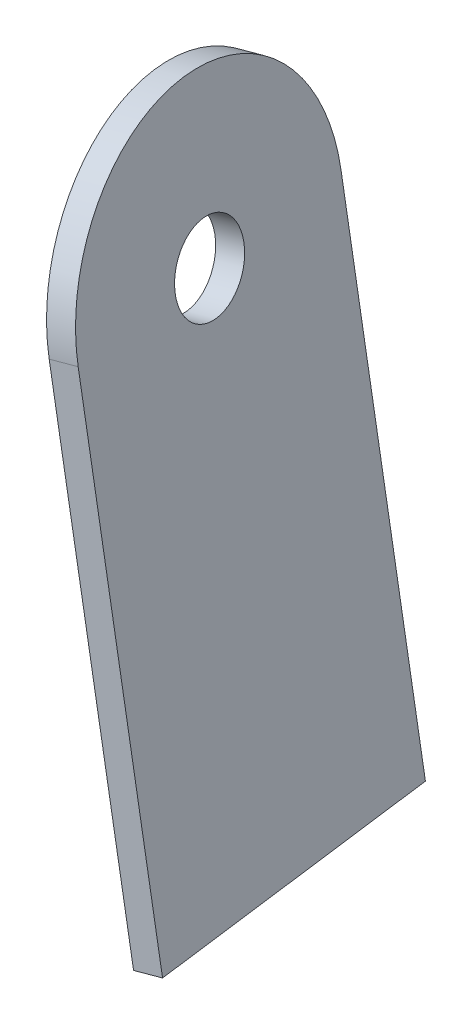
ISO-10303-21;
HEADER;
FILE_DESCRIPTION(('STEP AP214'),'2;1');
FILE_NAME('part.step','',(''),(''),'','','');
FILE_SCHEMA(('AUTOMOTIVE_DESIGN { 1 0 10303 214 1 1 1 1 }'));
ENDSEC;
DATA;
#1=APPLICATION_CONTEXT('core data for automotive mechanical design processes');
#2=APPLICATION_PROTOCOL_DEFINITION('international standard','automotive_design',2000,#1);
#3=PRODUCT_CONTEXT('',#1,'mechanical');
#4=PRODUCT('Part','Part','',(#3));
#5=PRODUCT_RELATED_PRODUCT_CATEGORY('part','',(#4));
#6=PRODUCT_DEFINITION_FORMATION('','',#4);
#7=PRODUCT_DEFINITION_CONTEXT('part definition',#1,'design');
#8=PRODUCT_DEFINITION('design','',#6,#7);
#9=PRODUCT_DEFINITION_SHAPE('','',#8);
#10=(LENGTH_UNIT() NAMED_UNIT(*) SI_UNIT(.MILLI.,.METRE.));
#11=(NAMED_UNIT(*) PLANE_ANGLE_UNIT() SI_UNIT($,.RADIAN.));
#12=(NAMED_UNIT(*) SI_UNIT($,.STERADIAN.) SOLID_ANGLE_UNIT());
#13=UNCERTAINTY_MEASURE_WITH_UNIT(LENGTH_MEASURE(1.E-05),#10,'distance_accuracy_value','');
#14=(GEOMETRIC_REPRESENTATION_CONTEXT(3) GLOBAL_UNCERTAINTY_ASSIGNED_CONTEXT((#13)) GLOBAL_UNIT_ASSIGNED_CONTEXT((#10,
#11,#12)) REPRESENTATION_CONTEXT('',''));
#15=CARTESIAN_POINT('',(0.,0.,0.));
#16=DIRECTION('',(0.,0.,1.));
#17=DIRECTION('',(1.,0.,0.));
#18=AXIS2_PLACEMENT_3D('',#15,#16,#17);
#19=CARTESIAN_POINT('',(366.374719779069,-183.61507369825,-606.828394282392));
#20=DIRECTION('',(-0.97605930706617,-0.162811693157859,0.144224067549693));
#21=DIRECTION('',(-0.164531864547568,0.986371768426338,0.));
#22=AXIS2_PLACEMENT_3D('',#19,#20,#21);
#23=PLANE('',#22);
#24=DIRECTION('',(-0.143282352776934,-0.0175746658269811,-0.989525794764228));
#25=VECTOR('',#24,1.);
#26=CARTESIAN_POINT('',(372.727263693812,-213.516214065003,-597.591348457077));
#27=LINE('',#26,#25);
#28=CARTESIAN_POINT('',(372.727263693812,-213.516214065003,-597.591348457077));
#29=VERTEX_POINT('',#28);
#30=CARTESIAN_POINT('',(369.997734873412,-213.851011449007,-616.441814847336));
#31=VERTEX_POINT('',#30);
#32=EDGE_CURVE('E95',#29,#31,#27,.T.);
#33=ORIENTED_EDGE('',*,*,#32,.F.);
#34=DIRECTION('',(0.163641059860335,-0.986500625287253,-0.00617412630625064));
#35=VECTOR('',#34,1.);
#36=CARTESIAN_POINT('',(367.739484189269,-183.447675006248,-597.403161087262));
#37=LINE('',#36,#35);
#38=CARTESIAN_POINT('',(367.739484189269,-183.447675006248,-597.403161087262));
#39=VERTEX_POINT('',#38);
#40=EDGE_CURVE('E98',#39,#29,#37,.T.);
#41=ORIENTED_EDGE('',*,*,#40,.F.);
#42=CARTESIAN_POINT('',(366.374719779069,-183.61507369825,-606.828394282392));
#43=DIRECTION('',(0.97605930706617,0.162811693157859,-0.144224067549693));
#44=DIRECTION('',(-0.164531864547568,0.986371768426338,0.));
#45=AXIS2_PLACEMENT_3D('',#42,#43,#44);
#46=CIRCLE('',#45,9.52500000000007);
#47=CARTESIAN_POINT('',(365.009955368868,-183.782472390252,-616.253627477521));
#48=VERTEX_POINT('',#47);
#49=EDGE_CURVE('E86',#48,#39,#46,.T.);
#50=ORIENTED_EDGE('',*,*,#49,.F.);
#51=DIRECTION('',(-0.163641059860335,0.986500625287253,0.00617412630625063));
#52=VECTOR('',#51,1.);
#53=CARTESIAN_POINT('',(369.997734873412,-213.851011449007,-616.441814847336));
#54=LINE('',#53,#52);
#55=EDGE_CURVE('E91',#31,#48,#54,.T.);
#56=ORIENTED_EDGE('',*,*,#55,.F.);
#57=EDGE_LOOP('',(#33,#41,#50,#56));
#58=FACE_BOUND('',#57,.T.);
#59=CARTESIAN_POINT('',(366.374719779069,-183.61507369825,-606.828394282392));
#60=DIRECTION('',(0.97605930706617,0.162811693157859,-0.144224067549693));
#61=DIRECTION('',(-0.164531864547568,0.986371768426338,0.));
#62=AXIS2_PLACEMENT_3D('',#59,#60,#61);
#63=CIRCLE('',#62,2.4891999999999);
#64=CARTESIAN_POINT('',(366.784272496301,-186.070350304217,-606.828394282392));
#65=VERTEX_POINT('',#64);
#66=EDGE_CURVE('E107',#65,#65,#63,.T.);
#67=ORIENTED_EDGE('',*,*,#66,.T.);
#68=EDGE_LOOP('',(#67));
#69=FACE_BOUND('',#68,.T.);
#70=ADVANCED_FACE('F39',(#58,#69),#23,.T.);
#71=CARTESIAN_POINT('',(367.924213929036,-183.356610135362,-607.057349989627));
#72=DIRECTION('',(-0.97605930706617,-0.162811693157859,0.144224067549693));
#73=DIRECTION('',(-0.164531864547568,0.986371768426338,0.));
#74=AXIS2_PLACEMENT_3D('',#71,#72,#73);
#75=PLANE('',#74);
#76=DIRECTION('',(-0.143282352776934,-0.0175746658269811,-0.989525794764228));
#77=VECTOR('',#76,1.);
#78=CARTESIAN_POINT('',(374.27675784378,-213.257750502115,-597.820304164312));
#79=LINE('',#78,#77);
#80=CARTESIAN_POINT('',(374.27675784378,-213.257750502115,-597.820304164312));
#81=VERTEX_POINT('',#80);
#82=CARTESIAN_POINT('',(371.547229023379,-213.592547886119,-616.670770554571));
#83=VERTEX_POINT('',#82);
#84=EDGE_CURVE('E103',#81,#83,#79,.T.);
#85=ORIENTED_EDGE('',*,*,#84,.T.);
#86=DIRECTION('',(-0.163641059860335,0.986500625287253,0.00617412630625063));
#87=VECTOR('',#86,1.);
#88=CARTESIAN_POINT('',(371.547229023379,-213.592547886119,-616.670770554571));
#89=LINE('',#88,#87);
#90=CARTESIAN_POINT('',(366.559449518836,-183.524008827364,-616.482583184756));
#91=VERTEX_POINT('',#90);
#92=EDGE_CURVE('E106',#83,#91,#89,.T.);
#93=ORIENTED_EDGE('',*,*,#92,.T.);
#94=CARTESIAN_POINT('',(367.924213929036,-183.356610135362,-607.057349989627));
#95=DIRECTION('',(0.97605930706617,0.162811693157859,-0.144224067549693));
#96=DIRECTION('',(-0.164531864547568,0.986371768426338,0.));
#97=AXIS2_PLACEMENT_3D('',#94,#95,#96);
#98=CIRCLE('',#97,9.52500000000007);
#99=CARTESIAN_POINT('',(369.288978339237,-183.18921144336,-597.632116794498));
#100=VERTEX_POINT('',#99);
#101=EDGE_CURVE('E89',#91,#100,#98,.T.);
#102=ORIENTED_EDGE('',*,*,#101,.T.);
#103=DIRECTION('',(0.163641059860335,-0.986500625287253,-0.00617412630625064));
#104=VECTOR('',#103,1.);
#105=CARTESIAN_POINT('',(369.288978339237,-183.18921144336,-597.632116794498));
#106=LINE('',#105,#104);
#107=EDGE_CURVE('E110',#100,#81,#106,.T.);
#108=ORIENTED_EDGE('',*,*,#107,.T.);
#109=EDGE_LOOP('',(#85,#93,#102,#108));
#110=FACE_BOUND('',#109,.T.);
#111=CARTESIAN_POINT('',(367.924213929036,-183.356610135362,-607.057349989627));
#112=DIRECTION('',(0.97605930706617,0.162811693157859,-0.144224067549693));
#113=DIRECTION('',(-0.164531864547568,0.986371768426338,0.));
#114=AXIS2_PLACEMENT_3D('',#111,#112,#113);
#115=CIRCLE('',#114,2.4891999999999);
#116=CARTESIAN_POINT('',(368.333766646268,-185.811886741329,-607.057349989627));
#117=VERTEX_POINT('',#116);
#118=EDGE_CURVE('E115',#117,#117,#115,.T.);
#119=ORIENTED_EDGE('',*,*,#118,.F.);
#120=EDGE_LOOP('',(#119));
#121=FACE_BOUND('',#120,.T.);
#122=ADVANCED_FACE('F128',(#110,#121),#75,.F.);
#123=CARTESIAN_POINT('',(372.727263693812,-213.516214065003,-597.591348457077));
#124=DIRECTION('',(-0.163641059860334,0.986500625287253,0.00617412630625166));
#125=DIRECTION('',(0.986519428445685,0.163644178934662,0.));
#126=AXIS2_PLACEMENT_3D('',#123,#124,#125);
#127=PLANE('',#126);
#128=ORIENTED_EDGE('',*,*,#84,.F.);
#129=DIRECTION('',(0.97605930706617,0.162811693157859,-0.144224067549693));
#130=VECTOR('',#129,1.);
#131=CARTESIAN_POINT('',(372.727263693812,-213.516214065003,-597.591348457077));
#132=LINE('',#131,#130);
#133=EDGE_CURVE('E56',#29,#81,#132,.T.);
#134=ORIENTED_EDGE('',*,*,#133,.F.);
#135=ORIENTED_EDGE('',*,*,#32,.T.);
#136=DIRECTION('',(0.97605930706617,0.162811693157859,-0.144224067549693));
#137=VECTOR('',#136,1.);
#138=CARTESIAN_POINT('',(369.997734873412,-213.851011449007,-616.441814847336));
#139=LINE('',#138,#137);
#140=EDGE_CURVE('E11',#31,#83,#139,.T.);
#141=ORIENTED_EDGE('',*,*,#140,.T.);
#142=EDGE_LOOP('',(#128,#134,#135,#141));
#143=FACE_BOUND('',#142,.T.);
#144=ADVANCED_FACE('F41',(#143),#127,.F.);
#145=CARTESIAN_POINT('',(369.997734873412,-213.851011449007,-616.441814847336));
#146=DIRECTION('',(0.143282352776934,0.0175746658269822,0.989525794764228));
#147=DIRECTION('',(-0.989678647035072,0.,0.143304485634015));
#148=AXIS2_PLACEMENT_3D('',#145,#146,#147);
#149=PLANE('',#148);
#150=ORIENTED_EDGE('',*,*,#92,.F.);
#151=ORIENTED_EDGE('',*,*,#140,.F.);
#152=ORIENTED_EDGE('',*,*,#55,.T.);
#153=DIRECTION('',(0.97605930706617,0.162811693157859,-0.144224067549693));
#154=VECTOR('',#153,1.);
#155=CARTESIAN_POINT('',(365.009955368868,-183.782472390252,-616.253627477521));
#156=LINE('',#155,#154);
#157=EDGE_CURVE('E48',#48,#91,#156,.T.);
#158=ORIENTED_EDGE('',*,*,#157,.T.);
#159=EDGE_LOOP('',(#150,#151,#152,#158));
#160=FACE_BOUND('',#159,.T.);
#161=ADVANCED_FACE('F92',(#160),#149,.F.);
#162=CARTESIAN_POINT('',(366.374719779069,-183.61507369825,-606.828394282392));
#163=DIRECTION('',(0.97605930706617,0.162811693157859,-0.144224067549693));
#164=DIRECTION('',(0.164531864547568,-0.986371768426338,0.));
#165=AXIS2_PLACEMENT_3D('',#162,#163,#164);
#166=CYLINDRICAL_SURFACE('',#165,9.52500000000007);
#167=ORIENTED_EDGE('',*,*,#101,.F.);
#168=ORIENTED_EDGE('',*,*,#157,.F.);
#169=ORIENTED_EDGE('',*,*,#49,.T.);
#170=DIRECTION('',(0.97605930706617,0.162811693157859,-0.144224067549693));
#171=VECTOR('',#170,1.);
#172=CARTESIAN_POINT('',(367.739484189269,-183.447675006248,-597.403161087262));
#173=LINE('',#172,#171);
#174=EDGE_CURVE('E72',#39,#100,#173,.T.);
#175=ORIENTED_EDGE('',*,*,#174,.T.);
#176=EDGE_LOOP('',(#167,#168,#169,#175));
#177=FACE_BOUND('',#176,.T.);
#178=ADVANCED_FACE('F84',(#177),#166,.T.);
#179=CARTESIAN_POINT('',(367.739484189269,-183.447675006248,-597.403161087262));
#180=DIRECTION('',(-0.143282352776934,-0.0175746658269822,-0.989525794764228));
#181=DIRECTION('',(0.989678647035072,0.,-0.143304485634015));
#182=AXIS2_PLACEMENT_3D('',#179,#180,#181);
#183=PLANE('',#182);
#184=ORIENTED_EDGE('',*,*,#107,.F.);
#185=ORIENTED_EDGE('',*,*,#174,.F.);
#186=ORIENTED_EDGE('',*,*,#40,.T.);
#187=ORIENTED_EDGE('',*,*,#133,.T.);
#188=EDGE_LOOP('',(#184,#185,#186,#187));
#189=FACE_BOUND('',#188,.T.);
#190=ADVANCED_FACE('F124',(#189),#183,.F.);
#191=CARTESIAN_POINT('',(366.374719779069,-183.61507369825,-606.828394282392));
#192=DIRECTION('',(0.97605930706617,0.162811693157859,-0.144224067549693));
#193=DIRECTION('',(0.164531864547568,-0.986371768426338,0.));
#194=AXIS2_PLACEMENT_3D('',#191,#192,#193);
#195=CYLINDRICAL_SURFACE('',#194,2.4891999999999);
#196=CARTESIAN_POINT('',(366.784272496301,-186.070350304217,-606.828394282392));
#197=CARTESIAN_POINT('',(366.800413060363,-186.067657975437,-606.830779237675));
#198=CARTESIAN_POINT('',(366.816553624425,-186.064965646657,-606.833164192959));
#199=CARTESIAN_POINT('',(366.848834752549,-186.059580989096,-606.837934103526));
#200=CARTESIAN_POINT('',(366.864975316611,-186.056888660316,-606.84031905881));
#201=CARTESIAN_POINT('',(366.897256444736,-186.051504002756,-606.845088969378));
#202=CARTESIAN_POINT('',(366.913397008798,-186.048811673976,-606.847473924661));
#203=CARTESIAN_POINT('',(366.945678136922,-186.043427016416,-606.852243835229));
#204=CARTESIAN_POINT('',(366.961818700984,-186.040734687636,-606.854628790512));
#205=CARTESIAN_POINT('',(366.994099829109,-186.035350030076,-606.85939870108));
#206=CARTESIAN_POINT('',(367.010240393171,-186.032657701296,-606.861783656363));
#207=CARTESIAN_POINT('',(367.042521521295,-186.027273043735,-606.866553566931));
#208=CARTESIAN_POINT('',(367.058662085357,-186.024580714955,-606.868938522215));
#209=CARTESIAN_POINT('',(367.090943213482,-186.019196057395,-606.873708432782));
#210=CARTESIAN_POINT('',(367.107083777544,-186.016503728615,-606.876093388066));
#211=CARTESIAN_POINT('',(367.139364905668,-186.011119071055,-606.880863298633));
#212=CARTESIAN_POINT('',(367.15550546973,-186.008426742275,-606.883248253917));
#213=CARTESIAN_POINT('',(367.187786597855,-186.003042084715,-606.888018164484));
#214=CARTESIAN_POINT('',(367.203927161917,-186.000349755935,-606.890403119768));
#215=CARTESIAN_POINT('',(367.236208290041,-185.994965098374,-606.895173030335));
#216=CARTESIAN_POINT('',(367.252348854103,-185.992272769594,-606.897557985619));
#217=CARTESIAN_POINT('',(367.284629982228,-185.986888112034,-606.902327896186));
#218=CARTESIAN_POINT('',(367.30077054629,-185.984195783254,-606.90471285147));
#219=CARTESIAN_POINT('',(367.333051674414,-185.978811125694,-606.909482762037));
#220=CARTESIAN_POINT('',(367.349192238476,-185.976118796914,-606.911867717321));
#221=CARTESIAN_POINT('',(367.381473366601,-185.970734139354,-606.916637627888));
#222=CARTESIAN_POINT('',(367.397613930663,-185.968041810574,-606.919022583172));
#223=CARTESIAN_POINT('',(367.429895058787,-185.962657153013,-606.92379249374));
#224=CARTESIAN_POINT('',(367.446035622849,-185.959964824233,-606.926177449023));
#225=CARTESIAN_POINT('',(367.478316750974,-185.954580166673,-606.930947359591));
#226=CARTESIAN_POINT('',(367.494457315036,-185.951887837893,-606.933332314874));
#227=CARTESIAN_POINT('',(367.52673844316,-185.946503180333,-606.938102225442));
#228=CARTESIAN_POINT('',(367.542879007222,-185.943810851553,-606.940487180725));
#229=CARTESIAN_POINT('',(367.575160135347,-185.938426193993,-606.945257091293));
#230=CARTESIAN_POINT('',(367.591300699409,-185.935733865213,-606.947642046577));
#231=CARTESIAN_POINT('',(367.623581827533,-185.930349207652,-606.952411957144));
#232=CARTESIAN_POINT('',(367.639722391595,-185.927656878872,-606.954796912428));
#233=CARTESIAN_POINT('',(367.67200351972,-185.922272221312,-606.959566822995));
#234=CARTESIAN_POINT('',(367.688144083782,-185.919579892532,-606.961951778279));
#235=CARTESIAN_POINT('',(367.720425211906,-185.914195234972,-606.966721688846));
#236=CARTESIAN_POINT('',(367.736565775968,-185.911502906192,-606.96910664413));
#237=CARTESIAN_POINT('',(367.768846904093,-185.906118248632,-606.973876554697));
#238=CARTESIAN_POINT('',(367.784987468155,-185.903425919852,-606.976261509981));
#239=CARTESIAN_POINT('',(367.817268596279,-185.898041262291,-606.981031420548));
#240=CARTESIAN_POINT('',(367.833409160341,-185.895348933511,-606.983416375832));
#241=CARTESIAN_POINT('',(367.865690288465,-185.889964275951,-606.988186286399));
#242=CARTESIAN_POINT('',(367.881830852528,-185.887271947171,-606.990571241683));
#243=CARTESIAN_POINT('',(367.914111980652,-185.881887289611,-606.995341152251));
#244=CARTESIAN_POINT('',(367.930252544714,-185.879194960831,-606.997726107534));
#245=CARTESIAN_POINT('',(367.962533672838,-185.873810303271,-607.002496018102));
#246=CARTESIAN_POINT('',(367.978674236901,-185.871117974491,-607.004880973385));
#247=CARTESIAN_POINT('',(368.010955365025,-185.86573331693,-607.009650883953));
#248=CARTESIAN_POINT('',(368.027095929087,-185.86304098815,-607.012035839236));
#249=CARTESIAN_POINT('',(368.059377057211,-185.85765633059,-607.016805749804));
#250=CARTESIAN_POINT('',(368.075517621274,-185.85496400181,-607.019190705088));
#251=CARTESIAN_POINT('',(368.107798749398,-185.84957934425,-607.023960615655));
#252=CARTESIAN_POINT('',(368.12393931346,-185.84688701547,-607.026345570939));
#253=CARTESIAN_POINT('',(368.156220441584,-185.84150235791,-607.031115481506));
#254=CARTESIAN_POINT('',(368.172361005647,-185.83881002913,-607.03350043679));
#255=CARTESIAN_POINT('',(368.204642133771,-185.833425371569,-607.038270347357));
#256=CARTESIAN_POINT('',(368.220782697833,-185.830733042789,-607.040655302641));
#257=CARTESIAN_POINT('',(368.253063825957,-185.825348385229,-607.045425213208));
#258=CARTESIAN_POINT('',(368.269204390019,-185.822656056449,-607.047810168492));
#259=CARTESIAN_POINT('',(368.301485518144,-185.817271398889,-607.052580079059));
#260=CARTESIAN_POINT('',(368.317626082206,-185.814579070109,-607.054965034343));
#261=CARTESIAN_POINT('',(368.333766646268,-185.811886741329,-607.057349989627));
#262=B_SPLINE_CURVE_WITH_KNOTS('',3,(#196,#197,#198,#199,#200,#201,#202,#203,#204,#205,#206,
#207,#208,#209,#210,#211,#212,#213,#214,#215,#216,#217,#218,#219,#220,#221,#222,#223,#224,#225,
#226,#227,#228,#229,#230,#231,#232,#233,#234,#235,#236,#237,#238,#239,#240,#241,#242,#243,#244,
#245,#246,#247,#248,#249,#250,#251,#252,#253,#254,#255,#256,#257,#258,#259,#260,#261),
.UNSPECIFIED.,.F.,.F.,(4,2,2,2,2,2,2,2,2,2,2,2,2,2,2,2,2,2,2,2,2,2,2,2,2,2,2,2,2,2,2,2,4),(0.,
0.0496093750000133,0.0992187500000266,0.148828125000024,0.198437500000037,0.248046875000046,
0.297656250000005,0.347265625000002,0.396875000000016,0.446484375000029,0.496093750000042,
0.545703125000001,0.595312499999999,0.644921875000012,0.694531250000025,0.744140625000039,
0.793749999999982,0.843359374999995,0.892968750000004,0.942578125000017,0.99218750000003,
1.04179687500003,1.09140624999999,1.141015625,1.19062500000001,1.24023437500001,
1.28984375000002,1.33945312499998,1.3890625,1.43867187500001,1.48828125,1.53789062500002,
1.58750000000003),.UNSPECIFIED.);
#263=EDGE_CURVE('BSEAM121',#65,#117,#262,.T.);
#264=ORIENTED_EDGE('',*,*,#66,.F.);
#265=ORIENTED_EDGE('',*,*,#118,.T.);
#266=ORIENTED_EDGE('',*,*,#263,.T.);
#267=ORIENTED_EDGE('',*,*,#263,.F.);
#268=EDGE_LOOP('',(#264,#266,#265,#267));
#269=FACE_BOUND('',#268,.T.);
#270=ADVANCED_FACE('F121',(#269),#195,.F.);
#271=CLOSED_SHELL('',(#70,#122,#144,#161,#178,#190,#270));
#272=MANIFOLD_SOLID_BREP('B2',#271);
#273=ADVANCED_BREP_SHAPE_REPRESENTATION('',(#18,#272),#14);
#274=SHAPE_DEFINITION_REPRESENTATION(#9,#273);
ENDSEC;
END-ISO-10303-21;
